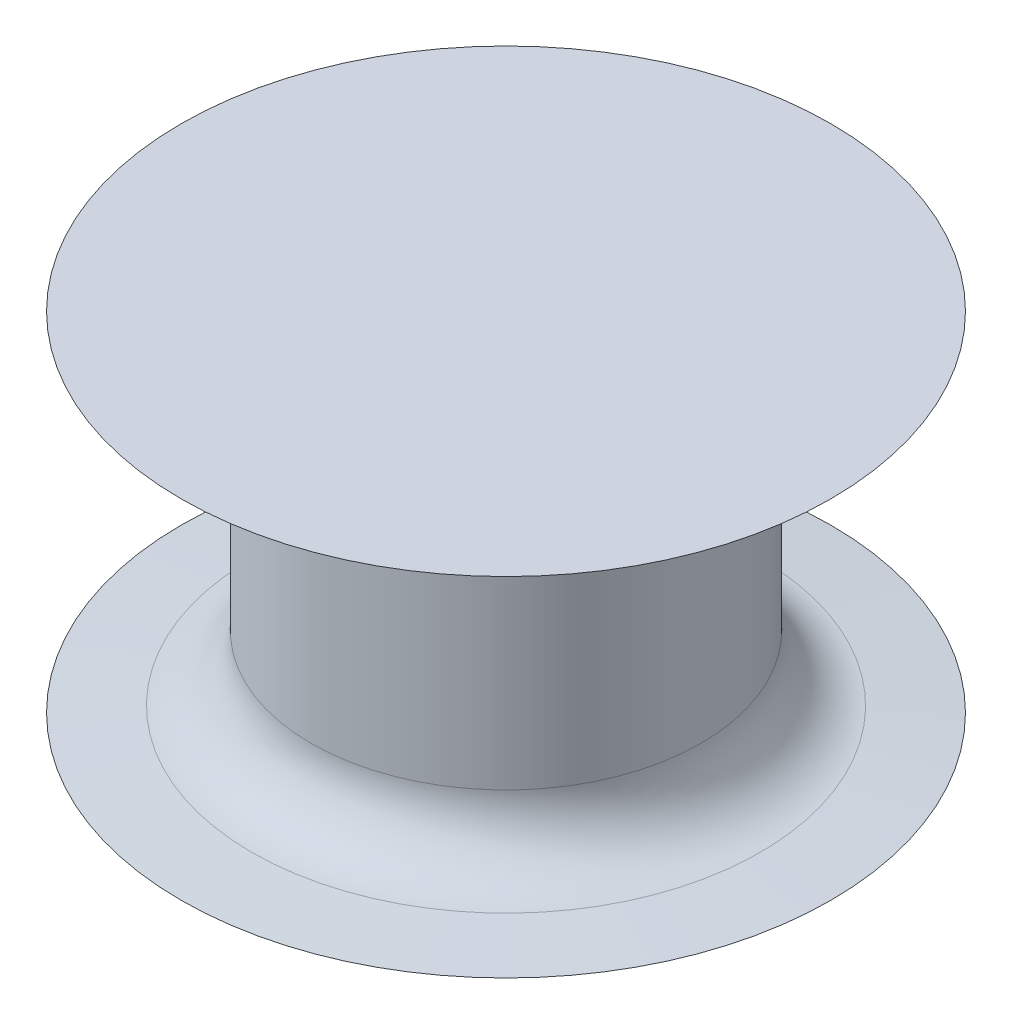
ISO-10303-21;
HEADER;
FILE_DESCRIPTION(('STEP AP214'),'2;1');
FILE_NAME('part.step','',(''),(''),'','','');
FILE_SCHEMA(('AUTOMOTIVE_DESIGN { 1 0 10303 214 1 1 1 1 }'));
ENDSEC;
DATA;
#1=APPLICATION_CONTEXT('core data for automotive mechanical design processes');
#2=APPLICATION_PROTOCOL_DEFINITION('international standard','automotive_design',2000,#1);
#3=PRODUCT_CONTEXT('',#1,'mechanical');
#4=PRODUCT('Part','Part','',(#3));
#5=PRODUCT_RELATED_PRODUCT_CATEGORY('part','',(#4));
#6=PRODUCT_DEFINITION_FORMATION('','',#4);
#7=PRODUCT_DEFINITION_CONTEXT('part definition',#1,'design');
#8=PRODUCT_DEFINITION('design','',#6,#7);
#9=PRODUCT_DEFINITION_SHAPE('','',#8);
#10=(LENGTH_UNIT() NAMED_UNIT(*) SI_UNIT(.MILLI.,.METRE.));
#11=(NAMED_UNIT(*) PLANE_ANGLE_UNIT() SI_UNIT($,.RADIAN.));
#12=(NAMED_UNIT(*) SI_UNIT($,.STERADIAN.) SOLID_ANGLE_UNIT());
#13=UNCERTAINTY_MEASURE_WITH_UNIT(LENGTH_MEASURE(1.E-05),#10,'distance_accuracy_value','');
#14=(GEOMETRIC_REPRESENTATION_CONTEXT(3) GLOBAL_UNCERTAINTY_ASSIGNED_CONTEXT((#13)) GLOBAL_UNIT_ASSIGNED_CONTEXT((#10,
#11,#12)) REPRESENTATION_CONTEXT('',''));
#15=CARTESIAN_POINT('',(0.,0.,0.));
#16=DIRECTION('',(0.,0.,1.));
#17=DIRECTION('',(1.,0.,0.));
#18=AXIS2_PLACEMENT_3D('',#15,#16,#17);
#19=CARTESIAN_POINT('',(0.,2.5,0.));
#20=DIRECTION('',(0.,-1.,0.));
#21=DIRECTION('',(0.,0.,-1.));
#22=AXIS2_PLACEMENT_3D('',#19,#20,#21);
#23=CYLINDRICAL_SURFACE('',#22,1.5);
#24=CARTESIAN_POINT('',(0.,0.45816558700871,0.));
#25=DIRECTION('',(0.,1.,0.));
#26=DIRECTION('',(0.,0.,1.));
#27=AXIS2_PLACEMENT_3D('',#24,#25,#26);
#28=CIRCLE('',#27,1.5);
#29=CARTESIAN_POINT('',(0.,0.45816558700871,1.5));
#30=VERTEX_POINT('',#29);
#31=EDGE_CURVE('E45',#30,#30,#28,.T.);
#32=ORIENTED_EDGE('',*,*,#31,.T.);
#33=EDGE_LOOP('',(#32));
#34=FACE_BOUND('',#33,.T.);
#35=CARTESIAN_POINT('',(0.,2.04183441299129,0.));
#36=DIRECTION('',(0.,1.,0.));
#37=DIRECTION('',(0.,0.,1.));
#38=AXIS2_PLACEMENT_3D('',#35,#36,#37);
#39=CIRCLE('',#38,1.5);
#40=CARTESIAN_POINT('',(0.,2.04183441299129,1.5));
#41=VERTEX_POINT('',#40);
#42=EDGE_CURVE('E50',#41,#41,#39,.F.);
#43=ORIENTED_EDGE('',*,*,#42,.T.);
#44=EDGE_LOOP('',(#43));
#45=FACE_BOUND('',#44,.T.);
#46=ADVANCED_FACE('F37',(#34,#45),#23,.T.);
#47=CARTESIAN_POINT('',(0.,2.58748866352593,-2.5));
#48=DIRECTION('',(0.,-1.,0.));
#49=DIRECTION('',(0.,0.,-1.));
#50=AXIS2_PLACEMENT_3D('',#47,#48,#49);
#51=PLANE('',#50);
#52=CARTESIAN_POINT('',(0.,2.58748866352593,0.));
#53=DIRECTION('',(0.,1.,0.));
#54=DIRECTION('',(0.,0.,1.));
#55=AXIS2_PLACEMENT_3D('',#52,#53,#54);
#56=CIRCLE('',#55,2.5);
#57=CARTESIAN_POINT('',(0.,2.58748866352593,2.5));
#58=VERTEX_POINT('',#57);
#59=EDGE_CURVE('E61',#58,#58,#56,.T.);
#60=ORIENTED_EDGE('',*,*,#59,.T.);
#61=EDGE_LOOP('',(#60));
#62=FACE_BOUND('',#61,.T.);
#63=ADVANCED_FACE('F85',(#62),#51,.F.);
#64=CARTESIAN_POINT('',(0.,2.5,0.));
#65=DIRECTION('',(0.,1.,0.));
#66=DIRECTION('',(0.,0.,1.));
#67=AXIS2_PLACEMENT_3D('',#64,#65,#66);
#68=CONICAL_SURFACE('',#67,1.5,1.48352986419518);
#69=CARTESIAN_POINT('',(0.,2.53993176203716,0.));
#70=DIRECTION('',(0.,1.,0.));
#71=DIRECTION('',(0.,0.,1.));
#72=AXIS2_PLACEMENT_3D('',#69,#70,#71);
#73=CIRCLE('',#72,1.95642212862617);
#74=CARTESIAN_POINT('',(0.,2.53993176203716,1.95642212862617));
#75=VERTEX_POINT('',#74);
#76=EDGE_CURVE('E55',#75,#75,#73,.T.);
#77=ORIENTED_EDGE('',*,*,#76,.T.);
#78=EDGE_LOOP('',(#77));
#79=FACE_BOUND('',#78,.T.);
#80=ORIENTED_EDGE('',*,*,#59,.F.);
#81=EDGE_LOOP('',(#80));
#82=FACE_BOUND('',#81,.T.);
#83=ADVANCED_FACE('F81',(#79,#82),#68,.T.);
#84=CARTESIAN_POINT('',(0.,2.04183441299129,0.));
#85=DIRECTION('',(0.,1.,0.));
#86=DIRECTION('',(0.,0.,1.));
#87=AXIS2_PLACEMENT_3D('',#84,#85,#86);
#88=TOROIDAL_SURFACE('',#87,2.,0.5);
#89=ORIENTED_EDGE('',*,*,#42,.F.);
#90=EDGE_LOOP('',(#89));
#91=FACE_BOUND('',#90,.T.);
#92=ORIENTED_EDGE('',*,*,#76,.F.);
#93=EDGE_LOOP('',(#92));
#94=FACE_BOUND('',#93,.T.);
#95=ADVANCED_FACE('F74',(#91,#94),#88,.F.);
#96=CARTESIAN_POINT('',(0.,-0.0874886635259275,-2.5));
#97=DIRECTION('',(0.,1.,0.));
#98=DIRECTION('',(0.,0.,-1.));
#99=AXIS2_PLACEMENT_3D('',#96,#97,#98);
#100=PLANE('',#99);
#101=CARTESIAN_POINT('',(0.,-0.0874886635259275,0.));
#102=DIRECTION('',(0.,1.,0.));
#103=DIRECTION('',(0.,0.,1.));
#104=AXIS2_PLACEMENT_3D('',#101,#102,#103);
#105=CIRCLE('',#104,2.5);
#106=CARTESIAN_POINT('',(0.,-0.0874886635259275,2.5));
#107=VERTEX_POINT('',#106);
#108=EDGE_CURVE('E65',#107,#107,#105,.T.);
#109=ORIENTED_EDGE('',*,*,#108,.F.);
#110=EDGE_LOOP('',(#109));
#111=FACE_BOUND('',#110,.T.);
#112=ADVANCED_FACE('F72',(#111),#100,.F.);
#113=CARTESIAN_POINT('',(0.,0.,0.));
#114=DIRECTION('',(0.,-1.,0.));
#115=DIRECTION('',(0.,0.,1.));
#116=AXIS2_PLACEMENT_3D('',#113,#114,#115);
#117=CONICAL_SURFACE('',#116,1.5,1.48352986419518);
#118=CARTESIAN_POINT('',(0.,-0.0399317620371625,0.));
#119=DIRECTION('',(0.,-1.,0.));
#120=DIRECTION('',(0.,0.,-1.));
#121=AXIS2_PLACEMENT_3D('',#118,#119,#120);
#122=CIRCLE('',#121,1.95642212862617);
#123=CARTESIAN_POINT('',(0.,-0.0399317620371625,-1.95642212862617));
#124=VERTEX_POINT('',#123);
#125=EDGE_CURVE('E10',#124,#124,#122,.T.);
#126=ORIENTED_EDGE('',*,*,#125,.T.);
#127=EDGE_LOOP('',(#126));
#128=FACE_BOUND('',#127,.T.);
#129=ORIENTED_EDGE('',*,*,#108,.T.);
#130=EDGE_LOOP('',(#129));
#131=FACE_BOUND('',#130,.T.);
#132=ADVANCED_FACE('F70',(#128,#131),#117,.T.);
#133=CARTESIAN_POINT('',(0.,0.45816558700871,0.));
#134=DIRECTION('',(0.,1.,0.));
#135=DIRECTION('',(0.,0.,1.));
#136=AXIS2_PLACEMENT_3D('',#133,#134,#135);
#137=TOROIDAL_SURFACE('',#136,2.,0.5);
#138=ORIENTED_EDGE('',*,*,#125,.F.);
#139=EDGE_LOOP('',(#138));
#140=FACE_BOUND('',#139,.T.);
#141=ORIENTED_EDGE('',*,*,#31,.F.);
#142=EDGE_LOOP('',(#141));
#143=FACE_BOUND('',#142,.T.);
#144=ADVANCED_FACE('F39',(#140,#143),#137,.F.);
#145=CLOSED_SHELL('',(#46,#63,#83,#95,#112,#132,#144));
#146=MANIFOLD_SOLID_BREP('B2',#145);
#147=ADVANCED_BREP_SHAPE_REPRESENTATION('',(#18,#146),#14);
#148=SHAPE_DEFINITION_REPRESENTATION(#9,#147);
ENDSEC;
END-ISO-10303-21;
